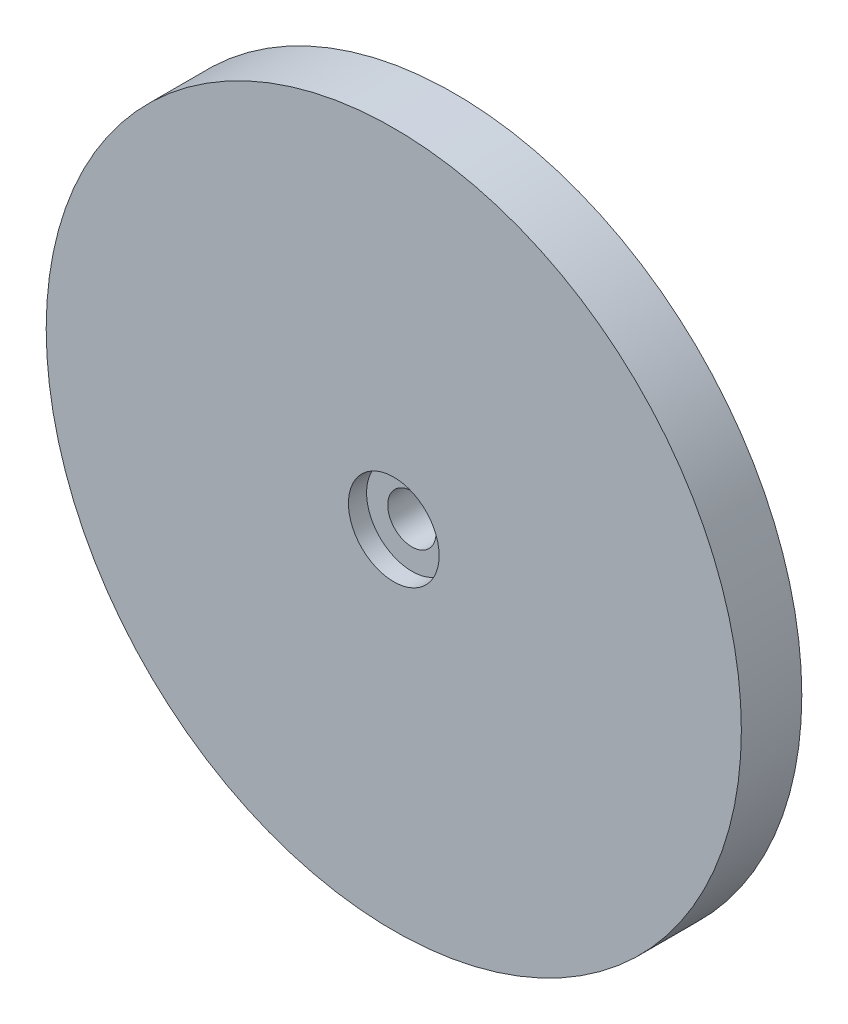
ISO-10303-21;
HEADER;
FILE_DESCRIPTION(('STEP AP214'),'2;1');
FILE_NAME('part.step','',(''),(''),'','','');
FILE_SCHEMA(('AUTOMOTIVE_DESIGN { 1 0 10303 214 1 1 1 1 }'));
ENDSEC;
DATA;
#1=APPLICATION_CONTEXT('core data for automotive mechanical design processes');
#2=APPLICATION_PROTOCOL_DEFINITION('international standard','automotive_design',2000,#1);
#3=PRODUCT_CONTEXT('',#1,'mechanical');
#4=PRODUCT('Part','Part','',(#3));
#5=PRODUCT_RELATED_PRODUCT_CATEGORY('part','',(#4));
#6=PRODUCT_DEFINITION_FORMATION('','',#4);
#7=PRODUCT_DEFINITION_CONTEXT('part definition',#1,'design');
#8=PRODUCT_DEFINITION('design','',#6,#7);
#9=PRODUCT_DEFINITION_SHAPE('','',#8);
#10=(LENGTH_UNIT() NAMED_UNIT(*) SI_UNIT(.MILLI.,.METRE.));
#11=(NAMED_UNIT(*) PLANE_ANGLE_UNIT() SI_UNIT($,.RADIAN.));
#12=(NAMED_UNIT(*) SI_UNIT($,.STERADIAN.) SOLID_ANGLE_UNIT());
#13=UNCERTAINTY_MEASURE_WITH_UNIT(LENGTH_MEASURE(1.E-05),#10,'distance_accuracy_value','');
#14=(GEOMETRIC_REPRESENTATION_CONTEXT(3) GLOBAL_UNCERTAINTY_ASSIGNED_CONTEXT((#13)) GLOBAL_UNIT_ASSIGNED_CONTEXT((#10,
#11,#12)) REPRESENTATION_CONTEXT('',''));
#15=CARTESIAN_POINT('',(0.,0.,0.));
#16=DIRECTION('',(0.,0.,1.));
#17=DIRECTION('',(1.,0.,0.));
#18=AXIS2_PLACEMENT_3D('',#15,#16,#17);
#19=CARTESIAN_POINT('',(0.,0.,10.));
#20=DIRECTION('',(0.,0.,-1.));
#21=DIRECTION('',(-1.,0.,0.));
#22=AXIS2_PLACEMENT_3D('',#19,#20,#21);
#23=CYLINDRICAL_SURFACE('',#22,57.5);
#24=CARTESIAN_POINT('',(0.,0.,10.));
#25=DIRECTION('',(0.,0.,1.));
#26=DIRECTION('',(1.,0.,0.));
#27=AXIS2_PLACEMENT_3D('',#24,#25,#26);
#28=CIRCLE('',#27,57.5);
#29=CARTESIAN_POINT('',(57.5,0.,10.));
#30=VERTEX_POINT('',#29);
#31=EDGE_CURVE('E10',#30,#30,#28,.T.);
#32=ORIENTED_EDGE('',*,*,#31,.F.);
#33=EDGE_LOOP('',(#32));
#34=FACE_BOUND('',#33,.T.);
#35=CARTESIAN_POINT('',(0.,0.,0.));
#36=DIRECTION('',(0.,0.,1.));
#37=DIRECTION('',(1.,0.,0.));
#38=AXIS2_PLACEMENT_3D('',#35,#36,#37);
#39=CIRCLE('',#38,57.5);
#40=CARTESIAN_POINT('',(57.5,0.,0.));
#41=VERTEX_POINT('',#40);
#42=EDGE_CURVE('E34',#41,#41,#39,.T.);
#43=ORIENTED_EDGE('',*,*,#42,.T.);
#44=EDGE_LOOP('',(#43));
#45=FACE_BOUND('',#44,.T.);
#46=ADVANCED_FACE('F31',(#34,#45),#23,.T.);
#47=CARTESIAN_POINT('',(0.,0.,10.));
#48=DIRECTION('',(0.,0.,1.));
#49=DIRECTION('',(1.,0.,0.));
#50=AXIS2_PLACEMENT_3D('',#47,#48,#49);
#51=PLANE('',#50);
#52=CARTESIAN_POINT('',(0.,0.,10.));
#53=DIRECTION('',(0.,0.,1.));
#54=DIRECTION('',(1.,0.,0.));
#55=AXIS2_PLACEMENT_3D('',#52,#53,#54);
#56=CIRCLE('',#55,7.5);
#57=CARTESIAN_POINT('',(7.5,0.,10.));
#58=VERTEX_POINT('',#57);
#59=EDGE_CURVE('E43',#58,#58,#56,.T.);
#60=ORIENTED_EDGE('',*,*,#59,.F.);
#61=EDGE_LOOP('',(#60));
#62=FACE_BOUND('',#61,.T.);
#63=ORIENTED_EDGE('',*,*,#31,.T.);
#64=EDGE_LOOP('',(#63));
#65=FACE_BOUND('',#64,.T.);
#66=ADVANCED_FACE('F70',(#62,#65),#51,.T.);
#67=CARTESIAN_POINT('',(0.,0.,0.));
#68=DIRECTION('',(0.,0.,1.));
#69=DIRECTION('',(1.,0.,0.));
#70=AXIS2_PLACEMENT_3D('',#67,#68,#69);
#71=PLANE('',#70);
#72=CARTESIAN_POINT('',(0.,0.,0.));
#73=DIRECTION('',(0.,0.,1.));
#74=DIRECTION('',(1.,0.,0.));
#75=AXIS2_PLACEMENT_3D('',#72,#73,#74);
#76=CIRCLE('',#75,4.);
#77=CARTESIAN_POINT('',(4.,0.,0.));
#78=VERTEX_POINT('',#77);
#79=EDGE_CURVE('E51',#78,#78,#76,.T.);
#80=ORIENTED_EDGE('',*,*,#79,.T.);
#81=EDGE_LOOP('',(#80));
#82=FACE_BOUND('',#81,.T.);
#83=ORIENTED_EDGE('',*,*,#42,.F.);
#84=EDGE_LOOP('',(#83));
#85=FACE_BOUND('',#84,.T.);
#86=ADVANCED_FACE('F55',(#82,#85),#71,.F.);
#87=CARTESIAN_POINT('',(0.,0.,7.));
#88=DIRECTION('',(0.,0.,1.));
#89=DIRECTION('',(1.,0.,0.));
#90=AXIS2_PLACEMENT_3D('',#87,#88,#89);
#91=CYLINDRICAL_SURFACE('',#90,7.5);
#92=CARTESIAN_POINT('',(0.,0.,7.));
#93=DIRECTION('',(0.,0.,1.));
#94=DIRECTION('',(1.,0.,0.));
#95=AXIS2_PLACEMENT_3D('',#92,#93,#94);
#96=CIRCLE('',#95,7.5);
#97=CARTESIAN_POINT('',(7.5,0.,7.));
#98=VERTEX_POINT('',#97);
#99=EDGE_CURVE('E41',#98,#98,#96,.T.);
#100=ORIENTED_EDGE('',*,*,#99,.F.);
#101=EDGE_LOOP('',(#100));
#102=FACE_BOUND('',#101,.T.);
#103=ORIENTED_EDGE('',*,*,#59,.T.);
#104=EDGE_LOOP('',(#103));
#105=FACE_BOUND('',#104,.T.);
#106=ADVANCED_FACE('F66',(#102,#105),#91,.F.);
#107=CARTESIAN_POINT('',(0.,0.,7.));
#108=DIRECTION('',(0.,0.,1.));
#109=DIRECTION('',(1.,0.,0.));
#110=AXIS2_PLACEMENT_3D('',#107,#108,#109);
#111=PLANE('',#110);
#112=CARTESIAN_POINT('',(0.,0.,7.));
#113=DIRECTION('',(0.,0.,1.));
#114=DIRECTION('',(1.,0.,0.));
#115=AXIS2_PLACEMENT_3D('',#112,#113,#114);
#116=CIRCLE('',#115,4.);
#117=CARTESIAN_POINT('',(4.,0.,7.));
#118=VERTEX_POINT('',#117);
#119=EDGE_CURVE('E46',#118,#118,#116,.T.);
#120=ORIENTED_EDGE('',*,*,#119,.F.);
#121=EDGE_LOOP('',(#120));
#122=FACE_BOUND('',#121,.T.);
#123=ORIENTED_EDGE('',*,*,#99,.T.);
#124=EDGE_LOOP('',(#123));
#125=FACE_BOUND('',#124,.T.);
#126=ADVANCED_FACE('F60',(#122,#125),#111,.T.);
#127=CARTESIAN_POINT('',(0.,0.,0.));
#128=DIRECTION('',(0.,0.,1.));
#129=DIRECTION('',(1.,0.,0.));
#130=AXIS2_PLACEMENT_3D('',#127,#128,#129);
#131=CYLINDRICAL_SURFACE('',#130,4.);
#132=ORIENTED_EDGE('',*,*,#119,.T.);
#133=EDGE_LOOP('',(#132));
#134=FACE_BOUND('',#133,.T.);
#135=ORIENTED_EDGE('',*,*,#79,.F.);
#136=EDGE_LOOP('',(#135));
#137=FACE_BOUND('',#136,.T.);
#138=ADVANCED_FACE('F58',(#134,#137),#131,.F.);
#139=CLOSED_SHELL('',(#46,#66,#86,#106,#126,#138));
#140=MANIFOLD_SOLID_BREP('B2',#139);
#141=ADVANCED_BREP_SHAPE_REPRESENTATION('',(#18,#140),#14);
#142=SHAPE_DEFINITION_REPRESENTATION(#9,#141);
ENDSEC;
END-ISO-10303-21;
